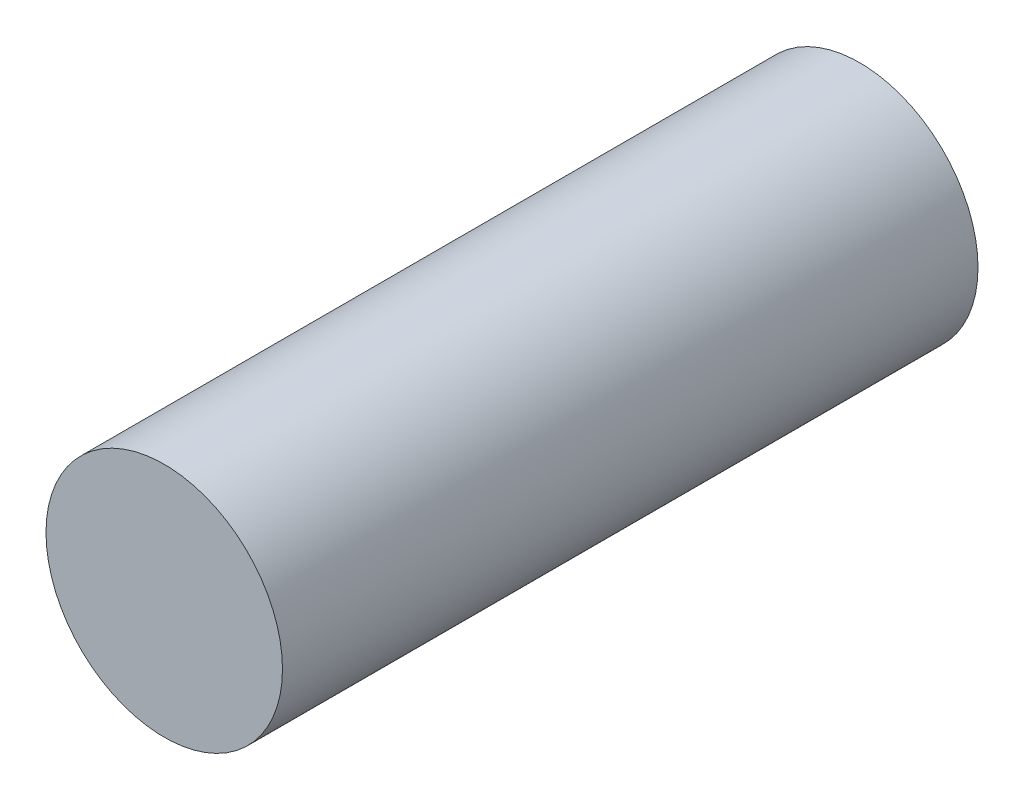
ISO-10303-21;
HEADER;
FILE_DESCRIPTION(('STEP AP214'),'2;1');
FILE_NAME('part.step','',(''),(''),'','','');
FILE_SCHEMA(('AUTOMOTIVE_DESIGN { 1 0 10303 214 1 1 1 1 }'));
ENDSEC;
DATA;
#1=APPLICATION_CONTEXT('core data for automotive mechanical design processes');
#2=APPLICATION_PROTOCOL_DEFINITION('international standard','automotive_design',2000,#1);
#3=PRODUCT_CONTEXT('',#1,'mechanical');
#4=PRODUCT('Part','Part','',(#3));
#5=PRODUCT_RELATED_PRODUCT_CATEGORY('part','',(#4));
#6=PRODUCT_DEFINITION_FORMATION('','',#4);
#7=PRODUCT_DEFINITION_CONTEXT('part definition',#1,'design');
#8=PRODUCT_DEFINITION('design','',#6,#7);
#9=PRODUCT_DEFINITION_SHAPE('','',#8);
#10=(LENGTH_UNIT() NAMED_UNIT(*) SI_UNIT(.MILLI.,.METRE.));
#11=(NAMED_UNIT(*) PLANE_ANGLE_UNIT() SI_UNIT($,.RADIAN.));
#12=(NAMED_UNIT(*) SI_UNIT($,.STERADIAN.) SOLID_ANGLE_UNIT());
#13=UNCERTAINTY_MEASURE_WITH_UNIT(LENGTH_MEASURE(1.E-05),#10,'distance_accuracy_value','');
#14=(GEOMETRIC_REPRESENTATION_CONTEXT(3) GLOBAL_UNCERTAINTY_ASSIGNED_CONTEXT((#13)) GLOBAL_UNIT_ASSIGNED_CONTEXT((#10,
#11,#12)) REPRESENTATION_CONTEXT('',''));
#15=CARTESIAN_POINT('',(0.,0.,0.));
#16=DIRECTION('',(0.,0.,1.));
#17=DIRECTION('',(1.,0.,0.));
#18=AXIS2_PLACEMENT_3D('',#15,#16,#17);
#19=CARTESIAN_POINT('',(0.,0.,100.));
#20=DIRECTION('',(0.,0.,-1.));
#21=DIRECTION('',(-1.,0.,0.));
#22=AXIS2_PLACEMENT_3D('',#19,#20,#21);
#23=CYLINDRICAL_SURFACE('',#22,17.);
#24=CARTESIAN_POINT('',(0.,0.,100.));
#25=DIRECTION('',(0.,0.,1.));
#26=DIRECTION('',(1.,0.,0.));
#27=AXIS2_PLACEMENT_3D('',#24,#25,#26);
#28=CIRCLE('',#27,17.);
#29=CARTESIAN_POINT('',(17.,0.,100.));
#30=VERTEX_POINT('',#29);
#31=EDGE_CURVE('E10',#30,#30,#28,.T.);
#32=ORIENTED_EDGE('',*,*,#31,.F.);
#33=EDGE_LOOP('',(#32));
#34=FACE_BOUND('',#33,.T.);
#35=CARTESIAN_POINT('',(0.,0.,0.));
#36=DIRECTION('',(0.,0.,1.));
#37=DIRECTION('',(1.,0.,0.));
#38=AXIS2_PLACEMENT_3D('',#35,#36,#37);
#39=CIRCLE('',#38,17.);
#40=CARTESIAN_POINT('',(17.,0.,0.));
#41=VERTEX_POINT('',#40);
#42=EDGE_CURVE('E34',#41,#41,#39,.T.);
#43=ORIENTED_EDGE('',*,*,#42,.T.);
#44=EDGE_LOOP('',(#43));
#45=FACE_BOUND('',#44,.T.);
#46=ADVANCED_FACE('F31',(#34,#45),#23,.T.);
#47=CARTESIAN_POINT('',(0.,0.,100.));
#48=DIRECTION('',(0.,0.,1.));
#49=DIRECTION('',(1.,0.,0.));
#50=AXIS2_PLACEMENT_3D('',#47,#48,#49);
#51=PLANE('',#50);
#52=ORIENTED_EDGE('',*,*,#31,.T.);
#53=EDGE_LOOP('',(#52));
#54=FACE_BOUND('',#53,.T.);
#55=ADVANCED_FACE('F46',(#54),#51,.T.);
#56=CARTESIAN_POINT('',(0.,0.,0.));
#57=DIRECTION('',(0.,0.,1.));
#58=DIRECTION('',(1.,0.,0.));
#59=AXIS2_PLACEMENT_3D('',#56,#57,#58);
#60=PLANE('',#59);
#61=ORIENTED_EDGE('',*,*,#42,.F.);
#62=EDGE_LOOP('',(#61));
#63=FACE_BOUND('',#62,.T.);
#64=ADVANCED_FACE('F44',(#63),#60,.F.);
#65=CLOSED_SHELL('',(#46,#55,#64));
#66=MANIFOLD_SOLID_BREP('B2',#65);
#67=ADVANCED_BREP_SHAPE_REPRESENTATION('',(#18,#66),#14);
#68=SHAPE_DEFINITION_REPRESENTATION(#9,#67);
ENDSEC;
END-ISO-10303-21;
